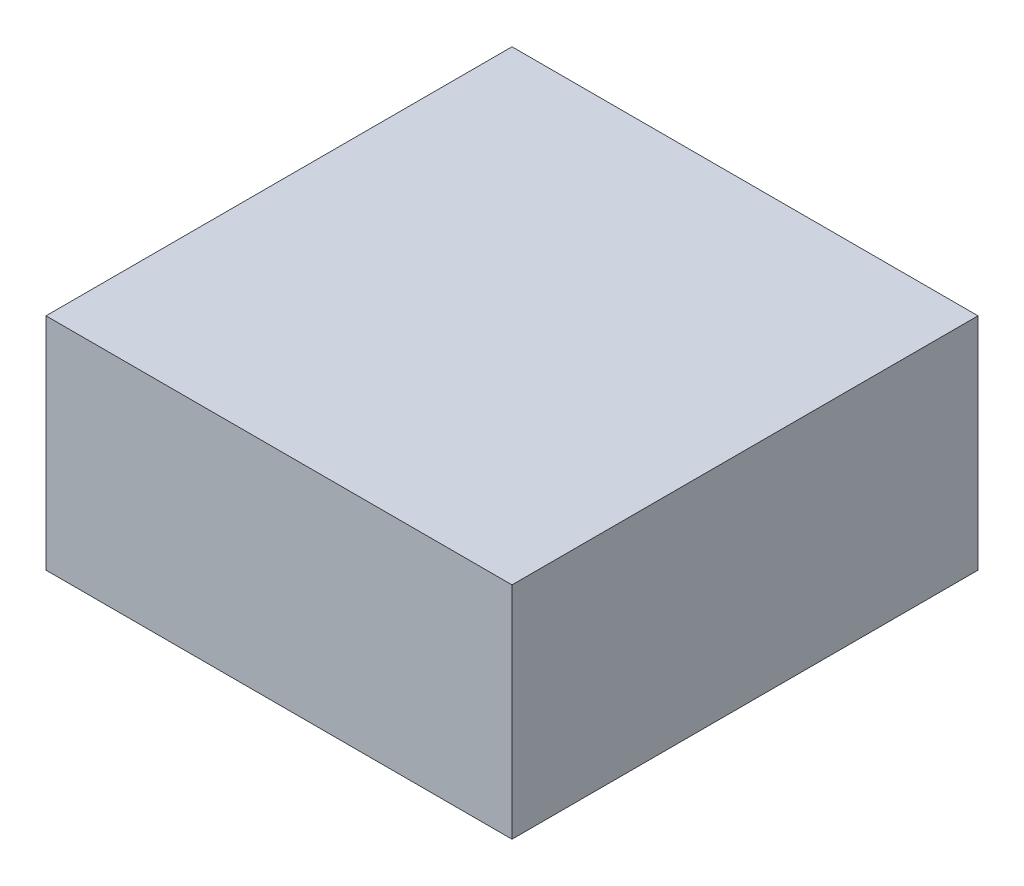
ISO-10303-21;
HEADER;
FILE_DESCRIPTION(('STEP AP214'),'2;1');
FILE_NAME('part.step','',(''),(''),'','','');
FILE_SCHEMA(('AUTOMOTIVE_DESIGN { 1 0 10303 214 1 1 1 1 }'));
ENDSEC;
DATA;
#1=APPLICATION_CONTEXT('core data for automotive mechanical design processes');
#2=APPLICATION_PROTOCOL_DEFINITION('international standard','automotive_design',2000,#1);
#3=PRODUCT_CONTEXT('',#1,'mechanical');
#4=PRODUCT('Part','Part','',(#3));
#5=PRODUCT_RELATED_PRODUCT_CATEGORY('part','',(#4));
#6=PRODUCT_DEFINITION_FORMATION('','',#4);
#7=PRODUCT_DEFINITION_CONTEXT('part definition',#1,'design');
#8=PRODUCT_DEFINITION('design','',#6,#7);
#9=PRODUCT_DEFINITION_SHAPE('','',#8);
#10=(LENGTH_UNIT() NAMED_UNIT(*) SI_UNIT(.MILLI.,.METRE.));
#11=(NAMED_UNIT(*) PLANE_ANGLE_UNIT() SI_UNIT($,.RADIAN.));
#12=(NAMED_UNIT(*) SI_UNIT($,.STERADIAN.) SOLID_ANGLE_UNIT());
#13=UNCERTAINTY_MEASURE_WITH_UNIT(LENGTH_MEASURE(1.E-05),#10,'distance_accuracy_value','');
#14=(GEOMETRIC_REPRESENTATION_CONTEXT(3) GLOBAL_UNCERTAINTY_ASSIGNED_CONTEXT((#13)) GLOBAL_UNIT_ASSIGNED_CONTEXT((#10,
#11,#12)) REPRESENTATION_CONTEXT('',''));
#15=CARTESIAN_POINT('',(0.,0.,0.));
#16=DIRECTION('',(0.,0.,1.));
#17=DIRECTION('',(1.,0.,0.));
#18=AXIS2_PLACEMENT_3D('',#15,#16,#17);
#19=CARTESIAN_POINT('',(275.,260.,275.));
#20=DIRECTION('',(-1.,0.,0.));
#21=DIRECTION('',(0.,0.,1.));
#22=AXIS2_PLACEMENT_3D('',#19,#20,#21);
#23=PLANE('',#22);
#24=DIRECTION('',(0.,0.,-1.));
#25=VECTOR('',#24,1.);
#26=CARTESIAN_POINT('',(275.,0.,275.));
#27=LINE('',#26,#25);
#28=CARTESIAN_POINT('',(275.,0.,275.));
#29=VERTEX_POINT('',#28);
#30=CARTESIAN_POINT('',(275.,0.,-275.));
#31=VERTEX_POINT('',#30);
#32=EDGE_CURVE('E99',#29,#31,#27,.T.);
#33=ORIENTED_EDGE('',*,*,#32,.T.);
#34=DIRECTION('',(0.,-1.,0.));
#35=VECTOR('',#34,1.);
#36=CARTESIAN_POINT('',(275.,260.,-275.));
#37=LINE('',#36,#35);
#38=CARTESIAN_POINT('',(275.,260.,-275.));
#39=VERTEX_POINT('',#38);
#40=EDGE_CURVE('E11',#39,#31,#37,.T.);
#41=ORIENTED_EDGE('',*,*,#40,.F.);
#42=DIRECTION('',(0.,0.,-1.));
#43=VECTOR('',#42,1.);
#44=CARTESIAN_POINT('',(275.,260.,275.));
#45=LINE('',#44,#43);
#46=CARTESIAN_POINT('',(275.,260.,275.));
#47=VERTEX_POINT('',#46);
#48=EDGE_CURVE('E87',#47,#39,#45,.T.);
#49=ORIENTED_EDGE('',*,*,#48,.F.);
#50=DIRECTION('',(0.,-1.,0.));
#51=VECTOR('',#50,1.);
#52=CARTESIAN_POINT('',(275.,260.,275.));
#53=LINE('',#52,#51);
#54=EDGE_CURVE('E95',#47,#29,#53,.T.);
#55=ORIENTED_EDGE('',*,*,#54,.T.);
#56=EDGE_LOOP('',(#33,#41,#49,#55));
#57=FACE_BOUND('',#56,.T.);
#58=ADVANCED_FACE('F36',(#57),#23,.F.);
#59=CARTESIAN_POINT('',(-275.,260.,-275.));
#60=DIRECTION('',(0.,0.,1.));
#61=DIRECTION('',(1.,0.,0.));
#62=AXIS2_PLACEMENT_3D('',#59,#60,#61);
#63=PLANE('',#62);
#64=DIRECTION('',(-1.,0.,0.));
#65=VECTOR('',#64,1.);
#66=CARTESIAN_POINT('',(-275.,0.,-275.));
#67=LINE('',#66,#65);
#68=CARTESIAN_POINT('',(-275.,0.,-275.));
#69=VERTEX_POINT('',#68);
#70=EDGE_CURVE('E91',#31,#69,#67,.T.);
#71=ORIENTED_EDGE('',*,*,#70,.T.);
#72=DIRECTION('',(0.,-1.,0.));
#73=VECTOR('',#72,1.);
#74=CARTESIAN_POINT('',(-275.,260.,-275.));
#75=LINE('',#74,#73);
#76=CARTESIAN_POINT('',(-275.,260.,-275.));
#77=VERTEX_POINT('',#76);
#78=EDGE_CURVE('E44',#77,#69,#75,.T.);
#79=ORIENTED_EDGE('',*,*,#78,.F.);
#80=DIRECTION('',(-1.,0.,0.));
#81=VECTOR('',#80,1.);
#82=CARTESIAN_POINT('',(-275.,260.,-275.));
#83=LINE('',#82,#81);
#84=EDGE_CURVE('E82',#39,#77,#83,.T.);
#85=ORIENTED_EDGE('',*,*,#84,.F.);
#86=ORIENTED_EDGE('',*,*,#40,.T.);
#87=EDGE_LOOP('',(#71,#79,#85,#86));
#88=FACE_BOUND('',#87,.T.);
#89=ADVANCED_FACE('F90',(#88),#63,.F.);
#90=CARTESIAN_POINT('',(-275.,260.,275.));
#91=DIRECTION('',(1.,0.,0.));
#92=DIRECTION('',(0.,0.,-1.));
#93=AXIS2_PLACEMENT_3D('',#90,#91,#92);
#94=PLANE('',#93);
#95=DIRECTION('',(0.,0.,1.));
#96=VECTOR('',#95,1.);
#97=CARTESIAN_POINT('',(-275.,0.,275.));
#98=LINE('',#97,#96);
#99=CARTESIAN_POINT('',(-275.,0.,275.));
#100=VERTEX_POINT('',#99);
#101=EDGE_CURVE('E69',#69,#100,#98,.T.);
#102=ORIENTED_EDGE('',*,*,#101,.T.);
#103=DIRECTION('',(0.,-1.,0.));
#104=VECTOR('',#103,1.);
#105=CARTESIAN_POINT('',(-275.,260.,275.));
#106=LINE('',#105,#104);
#107=CARTESIAN_POINT('',(-275.,260.,275.));
#108=VERTEX_POINT('',#107);
#109=EDGE_CURVE('E92',#108,#100,#106,.T.);
#110=ORIENTED_EDGE('',*,*,#109,.F.);
#111=DIRECTION('',(0.,0.,1.));
#112=VECTOR('',#111,1.);
#113=CARTESIAN_POINT('',(-275.,260.,275.));
#114=LINE('',#113,#112);
#115=EDGE_CURVE('E85',#77,#108,#114,.T.);
#116=ORIENTED_EDGE('',*,*,#115,.F.);
#117=ORIENTED_EDGE('',*,*,#78,.T.);
#118=EDGE_LOOP('',(#102,#110,#116,#117));
#119=FACE_BOUND('',#118,.T.);
#120=ADVANCED_FACE('F93',(#119),#94,.F.);
#121=CARTESIAN_POINT('',(-275.,260.,275.));
#122=DIRECTION('',(0.,0.,-1.));
#123=DIRECTION('',(-1.,0.,0.));
#124=AXIS2_PLACEMENT_3D('',#121,#122,#123);
#125=PLANE('',#124);
#126=DIRECTION('',(1.,0.,0.));
#127=VECTOR('',#126,1.);
#128=CARTESIAN_POINT('',(-275.,0.,275.));
#129=LINE('',#128,#127);
#130=EDGE_CURVE('E75',#100,#29,#129,.T.);
#131=ORIENTED_EDGE('',*,*,#130,.T.);
#132=ORIENTED_EDGE('',*,*,#54,.F.);
#133=DIRECTION('',(1.,0.,0.));
#134=VECTOR('',#133,1.);
#135=CARTESIAN_POINT('',(-275.,260.,275.));
#136=LINE('',#135,#134);
#137=EDGE_CURVE('E52',#108,#47,#136,.T.);
#138=ORIENTED_EDGE('',*,*,#137,.F.);
#139=ORIENTED_EDGE('',*,*,#109,.T.);
#140=EDGE_LOOP('',(#131,#132,#138,#139));
#141=FACE_BOUND('',#140,.T.);
#142=ADVANCED_FACE('F106',(#141),#125,.F.);
#143=CARTESIAN_POINT('',(0.,260.,0.));
#144=DIRECTION('',(0.,-1.,0.));
#145=DIRECTION('',(0.,0.,-1.));
#146=AXIS2_PLACEMENT_3D('',#143,#144,#145);
#147=PLANE('',#146);
#148=ORIENTED_EDGE('',*,*,#48,.T.);
#149=ORIENTED_EDGE('',*,*,#84,.T.);
#150=ORIENTED_EDGE('',*,*,#115,.T.);
#151=ORIENTED_EDGE('',*,*,#137,.T.);
#152=EDGE_LOOP('',(#148,#149,#150,#151));
#153=FACE_BOUND('',#152,.T.);
#154=ADVANCED_FACE('F83',(#153),#147,.F.);
#155=CARTESIAN_POINT('',(0.,0.,0.));
#156=DIRECTION('',(0.,-1.,0.));
#157=DIRECTION('',(0.,0.,-1.));
#158=AXIS2_PLACEMENT_3D('',#155,#156,#157);
#159=PLANE('',#158);
#160=ORIENTED_EDGE('',*,*,#32,.F.);
#161=ORIENTED_EDGE('',*,*,#130,.F.);
#162=ORIENTED_EDGE('',*,*,#101,.F.);
#163=ORIENTED_EDGE('',*,*,#70,.F.);
#164=EDGE_LOOP('',(#160,#161,#162,#163));
#165=FACE_BOUND('',#164,.T.);
#166=ADVANCED_FACE('F109',(#165),#159,.T.);
#167=CLOSED_SHELL('',(#58,#89,#120,#142,#154,#166));
#168=MANIFOLD_SOLID_BREP('B2',#167);
#169=ADVANCED_BREP_SHAPE_REPRESENTATION('',(#18,#168),#14);
#170=SHAPE_DEFINITION_REPRESENTATION(#9,#169);
ENDSEC;
END-ISO-10303-21;
